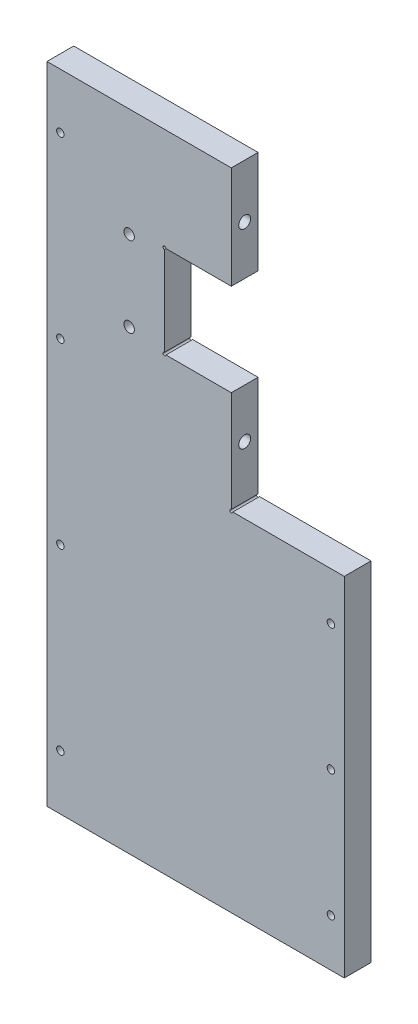
ISO-10303-21;
HEADER;
FILE_DESCRIPTION(('STEP AP214'),'2;1');
FILE_NAME('part.step','',(''),(''),'','','');
FILE_SCHEMA(('AUTOMOTIVE_DESIGN { 1 0 10303 214 1 1 1 1 }'));
ENDSEC;
DATA;
#1=APPLICATION_CONTEXT('core data for automotive mechanical design processes');
#2=APPLICATION_PROTOCOL_DEFINITION('international standard','automotive_design',2000,#1);
#3=PRODUCT_CONTEXT('',#1,'mechanical');
#4=PRODUCT('Part','Part','',(#3));
#5=PRODUCT_RELATED_PRODUCT_CATEGORY('part','',(#4));
#6=PRODUCT_DEFINITION_FORMATION('','',#4);
#7=PRODUCT_DEFINITION_CONTEXT('part definition',#1,'design');
#8=PRODUCT_DEFINITION('design','',#6,#7);
#9=PRODUCT_DEFINITION_SHAPE('','',#8);
#10=(LENGTH_UNIT() NAMED_UNIT(*) SI_UNIT(.MILLI.,.METRE.));
#11=(NAMED_UNIT(*) PLANE_ANGLE_UNIT() SI_UNIT($,.RADIAN.));
#12=(NAMED_UNIT(*) SI_UNIT($,.STERADIAN.) SOLID_ANGLE_UNIT());
#13=UNCERTAINTY_MEASURE_WITH_UNIT(LENGTH_MEASURE(1.E-05),#10,'distance_accuracy_value','');
#14=(GEOMETRIC_REPRESENTATION_CONTEXT(3) GLOBAL_UNCERTAINTY_ASSIGNED_CONTEXT((#13)) GLOBAL_UNIT_ASSIGNED_CONTEXT((#10,
#11,#12)) REPRESENTATION_CONTEXT('',''));
#15=CARTESIAN_POINT('',(0.,0.,0.));
#16=DIRECTION('',(0.,0.,1.));
#17=DIRECTION('',(1.,0.,0.));
#18=AXIS2_PLACEMENT_3D('',#15,#16,#17);
#19=CARTESIAN_POINT('',(0.,0.,18.));
#20=DIRECTION('',(1.,0.,0.));
#21=DIRECTION('',(0.,0.,-1.));
#22=AXIS2_PLACEMENT_3D('',#19,#20,#21);
#23=PLANE('',#22);
#24=DIRECTION('',(0.,-1.,0.));
#25=VECTOR('',#24,1.);
#26=CARTESIAN_POINT('',(0.,0.,0.));
#27=LINE('',#26,#25);
#28=CARTESIAN_POINT('',(0.,434.,0.));
#29=VERTEX_POINT('',#28);
#30=CARTESIAN_POINT('',(0.,0.,0.));
#31=VERTEX_POINT('',#30);
#32=EDGE_CURVE('E203',#29,#31,#27,.T.);
#33=ORIENTED_EDGE('',*,*,#32,.T.);
#34=DIRECTION('',(0.,0.,-1.));
#35=VECTOR('',#34,1.);
#36=CARTESIAN_POINT('',(0.,0.,18.));
#37=LINE('',#36,#35);
#38=CARTESIAN_POINT('',(0.,0.,18.));
#39=VERTEX_POINT('',#38);
#40=EDGE_CURVE('E179',#39,#31,#37,.T.);
#41=ORIENTED_EDGE('',*,*,#40,.F.);
#42=DIRECTION('',(0.,-1.,0.));
#43=VECTOR('',#42,1.);
#44=CARTESIAN_POINT('',(0.,0.,18.));
#45=LINE('',#44,#43);
#46=CARTESIAN_POINT('',(0.,434.,18.));
#47=VERTEX_POINT('',#46);
#48=EDGE_CURVE('E160',#47,#39,#45,.T.);
#49=ORIENTED_EDGE('',*,*,#48,.F.);
#50=DIRECTION('',(0.,0.,-1.));
#51=VECTOR('',#50,1.);
#52=CARTESIAN_POINT('',(0.,434.,18.));
#53=LINE('',#52,#51);
#54=EDGE_CURVE('E161',#47,#29,#53,.T.);
#55=ORIENTED_EDGE('',*,*,#54,.T.);
#56=EDGE_LOOP('',(#33,#41,#49,#55));
#57=FACE_BOUND('',#56,.T.);
#58=ADVANCED_FACE('F34',(#57),#23,.F.);
#59=CARTESIAN_POINT('',(0.,0.,18.));
#60=DIRECTION('',(0.,1.,0.));
#61=DIRECTION('',(0.,0.,1.));
#62=AXIS2_PLACEMENT_3D('',#59,#60,#61);
#63=PLANE('',#62);
#64=DIRECTION('',(1.,0.,0.));
#65=VECTOR('',#64,1.);
#66=CARTESIAN_POINT('',(0.,0.,0.));
#67=LINE('',#66,#65);
#68=CARTESIAN_POINT('',(200.,0.,0.));
#69=VERTEX_POINT('',#68);
#70=EDGE_CURVE('E206',#31,#69,#67,.T.);
#71=ORIENTED_EDGE('',*,*,#70,.T.);
#72=DIRECTION('',(0.,0.,-1.));
#73=VECTOR('',#72,1.);
#74=CARTESIAN_POINT('',(200.,0.,18.));
#75=LINE('',#74,#73);
#76=CARTESIAN_POINT('',(200.,0.,18.));
#77=VERTEX_POINT('',#76);
#78=EDGE_CURVE('E176',#77,#69,#75,.T.);
#79=ORIENTED_EDGE('',*,*,#78,.F.);
#80=DIRECTION('',(1.,0.,0.));
#81=VECTOR('',#80,1.);
#82=CARTESIAN_POINT('',(0.,0.,18.));
#83=LINE('',#82,#81);
#84=EDGE_CURVE('E219',#39,#77,#83,.T.);
#85=ORIENTED_EDGE('',*,*,#84,.F.);
#86=ORIENTED_EDGE('',*,*,#40,.T.);
#87=EDGE_LOOP('',(#71,#79,#85,#86));
#88=FACE_BOUND('',#87,.T.);
#89=ADVANCED_FACE('F348',(#88),#63,.F.);
#90=CARTESIAN_POINT('',(200.,0.,18.));
#91=DIRECTION('',(-1.,0.,0.));
#92=DIRECTION('',(0.,0.,1.));
#93=AXIS2_PLACEMENT_3D('',#90,#91,#92);
#94=PLANE('',#93);
#95=DIRECTION('',(0.,1.,0.));
#96=VECTOR('',#95,1.);
#97=CARTESIAN_POINT('',(200.,0.,0.));
#98=LINE('',#97,#96);
#99=CARTESIAN_POINT('',(200.,234.,0.));
#100=VERTEX_POINT('',#99);
#101=EDGE_CURVE('E149',#69,#100,#98,.T.);
#102=ORIENTED_EDGE('',*,*,#101,.T.);
#103=DIRECTION('',(0.,0.,-1.));
#104=VECTOR('',#103,1.);
#105=CARTESIAN_POINT('',(200.,234.,18.));
#106=LINE('',#105,#104);
#107=CARTESIAN_POINT('',(200.,234.,18.));
#108=VERTEX_POINT('',#107);
#109=EDGE_CURVE('E173',#108,#100,#106,.T.);
#110=ORIENTED_EDGE('',*,*,#109,.F.);
#111=DIRECTION('',(0.,1.,0.));
#112=VECTOR('',#111,1.);
#113=CARTESIAN_POINT('',(200.,0.,18.));
#114=LINE('',#113,#112);
#115=EDGE_CURVE('E218',#77,#108,#114,.T.);
#116=ORIENTED_EDGE('',*,*,#115,.F.);
#117=ORIENTED_EDGE('',*,*,#78,.T.);
#118=EDGE_LOOP('',(#102,#110,#116,#117));
#119=FACE_BOUND('',#118,.T.);
#120=ADVANCED_FACE('F211',(#119),#94,.F.);
#121=CARTESIAN_POINT('',(200.,234.,18.));
#122=DIRECTION('',(0.,-1.,0.));
#123=DIRECTION('',(0.,0.,-1.));
#124=AXIS2_PLACEMENT_3D('',#121,#122,#123);
#125=PLANE('',#124);
#126=DIRECTION('',(-1.,0.,0.));
#127=VECTOR('',#126,1.);
#128=CARTESIAN_POINT('',(200.,234.,0.));
#129=LINE('',#128,#127);
#130=CARTESIAN_POINT('',(125.,234.,0.));
#131=VERTEX_POINT('',#130);
#132=EDGE_CURVE('E145',#100,#131,#129,.T.);
#133=ORIENTED_EDGE('',*,*,#132,.T.);
#134=DIRECTION('',(0.,0.,1.));
#135=VECTOR('',#134,1.);
#136=CARTESIAN_POINT('',(125.,234.,0.));
#137=LINE('',#136,#135);
#138=CARTESIAN_POINT('',(125.,234.,18.));
#139=VERTEX_POINT('',#138);
#140=EDGE_CURVE('E48',#131,#139,#137,.T.);
#141=ORIENTED_EDGE('',*,*,#140,.T.);
#142=DIRECTION('',(-1.,0.,0.));
#143=VECTOR('',#142,1.);
#144=CARTESIAN_POINT('',(200.,234.,18.));
#145=LINE('',#144,#143);
#146=EDGE_CURVE('E195',#108,#139,#145,.T.);
#147=ORIENTED_EDGE('',*,*,#146,.F.);
#148=ORIENTED_EDGE('',*,*,#109,.T.);
#149=EDGE_LOOP('',(#133,#141,#147,#148));
#150=FACE_BOUND('',#149,.T.);
#151=ADVANCED_FACE('F216',(#150),#125,.F.);
#152=CARTESIAN_POINT('',(124.,303.,18.));
#153=DIRECTION('',(-1.,0.,0.));
#154=DIRECTION('',(0.,-1.,0.));
#155=AXIS2_PLACEMENT_3D('',#152,#153,#154);
#156=PLANE('',#155);
#157=CARTESIAN_POINT('',(124.,270.,9.00000000000006));
#158=DIRECTION('',(1.,0.,0.));
#159=DIRECTION('',(0.,0.,-1.));
#160=AXIS2_PLACEMENT_3D('',#157,#158,#159);
#161=CIRCLE('',#160,4.);
#162=CARTESIAN_POINT('',(124.,270.,5.00000000000006));
#163=VERTEX_POINT('',#162);
#164=EDGE_CURVE('E287',#163,#163,#161,.T.);
#165=ORIENTED_EDGE('',*,*,#164,.F.);
#166=EDGE_LOOP('',(#165));
#167=FACE_BOUND('',#166,.T.);
#168=DIRECTION('',(0.,1.,0.));
#169=VECTOR('',#168,1.);
#170=CARTESIAN_POINT('',(124.,303.,18.));
#171=LINE('',#170,#169);
#172=CARTESIAN_POINT('',(124.,235.,18.));
#173=VERTEX_POINT('',#172);
#174=CARTESIAN_POINT('',(124.,303.,18.));
#175=VERTEX_POINT('',#174);
#176=EDGE_CURVE('E138',#173,#175,#171,.T.);
#177=ORIENTED_EDGE('',*,*,#176,.F.);
#178=DIRECTION('',(0.,0.,1.));
#179=VECTOR('',#178,1.);
#180=CARTESIAN_POINT('',(124.,235.,0.));
#181=LINE('',#180,#179);
#182=CARTESIAN_POINT('',(124.,235.,0.));
#183=VERTEX_POINT('',#182);
#184=EDGE_CURVE('E126',#173,#183,#181,.F.);
#185=ORIENTED_EDGE('',*,*,#184,.T.);
#186=DIRECTION('',(0.,1.,0.));
#187=VECTOR('',#186,1.);
#188=CARTESIAN_POINT('',(124.,303.,0.));
#189=LINE('',#188,#187);
#190=CARTESIAN_POINT('',(124.,303.,0.));
#191=VERTEX_POINT('',#190);
#192=EDGE_CURVE('E136',#183,#191,#189,.T.);
#193=ORIENTED_EDGE('',*,*,#192,.T.);
#194=DIRECTION('',(0.,0.,-1.));
#195=VECTOR('',#194,1.);
#196=CARTESIAN_POINT('',(124.,303.,18.));
#197=LINE('',#196,#195);
#198=EDGE_CURVE('E171',#175,#191,#197,.T.);
#199=ORIENTED_EDGE('',*,*,#198,.F.);
#200=EDGE_LOOP('',(#177,#185,#193,#199));
#201=FACE_BOUND('',#200,.T.);
#202=ADVANCED_FACE('F134',(#167,#201),#156,.F.);
#203=CARTESIAN_POINT('',(79.,303.,18.));
#204=DIRECTION('',(0.,-1.,0.));
#205=DIRECTION('',(0.,0.,-1.));
#206=AXIS2_PLACEMENT_3D('',#203,#204,#205);
#207=PLANE('',#206);
#208=DIRECTION('',(-1.,0.,0.));
#209=VECTOR('',#208,1.);
#210=CARTESIAN_POINT('',(79.,303.,0.));
#211=LINE('',#210,#209);
#212=CARTESIAN_POINT('',(80.,303.,0.));
#213=VERTEX_POINT('',#212);
#214=EDGE_CURVE('E144',#191,#213,#211,.T.);
#215=ORIENTED_EDGE('',*,*,#214,.T.);
#216=DIRECTION('',(0.,0.,1.));
#217=VECTOR('',#216,1.);
#218=CARTESIAN_POINT('',(80.,303.,0.));
#219=LINE('',#218,#217);
#220=CARTESIAN_POINT('',(80.,303.,18.));
#221=VERTEX_POINT('',#220);
#222=EDGE_CURVE('E55',#213,#221,#219,.T.);
#223=ORIENTED_EDGE('',*,*,#222,.T.);
#224=DIRECTION('',(-1.,0.,0.));
#225=VECTOR('',#224,1.);
#226=CARTESIAN_POINT('',(79.,303.,18.));
#227=LINE('',#226,#225);
#228=EDGE_CURVE('E188',#175,#221,#227,.T.);
#229=ORIENTED_EDGE('',*,*,#228,.F.);
#230=ORIENTED_EDGE('',*,*,#198,.T.);
#231=EDGE_LOOP('',(#215,#223,#229,#230));
#232=FACE_BOUND('',#231,.T.);
#233=ADVANCED_FACE('F185',(#232),#207,.F.);
#234=CARTESIAN_POINT('',(79.,365.,18.));
#235=DIRECTION('',(-1.,0.,0.));
#236=DIRECTION('',(0.,-1.,0.));
#237=AXIS2_PLACEMENT_3D('',#234,#235,#236);
#238=PLANE('',#237);
#239=DIRECTION('',(0.,1.,0.));
#240=VECTOR('',#239,1.);
#241=CARTESIAN_POINT('',(79.,365.,18.));
#242=LINE('',#241,#240);
#243=CARTESIAN_POINT('',(79.,304.,18.));
#244=VERTEX_POINT('',#243);
#245=CARTESIAN_POINT('',(79.,364.,18.));
#246=VERTEX_POINT('',#245);
#247=EDGE_CURVE('E191',#244,#246,#242,.T.);
#248=ORIENTED_EDGE('',*,*,#247,.F.);
#249=DIRECTION('',(0.,0.,1.));
#250=VECTOR('',#249,1.);
#251=CARTESIAN_POINT('',(79.,304.,0.));
#252=LINE('',#251,#250);
#253=CARTESIAN_POINT('',(79.,304.,0.));
#254=VERTEX_POINT('',#253);
#255=EDGE_CURVE('E236',#244,#254,#252,.F.);
#256=ORIENTED_EDGE('',*,*,#255,.T.);
#257=DIRECTION('',(0.,1.,0.));
#258=VECTOR('',#257,1.);
#259=CARTESIAN_POINT('',(79.,365.,0.));
#260=LINE('',#259,#258);
#261=CARTESIAN_POINT('',(79.,364.,0.));
#262=VERTEX_POINT('',#261);
#263=EDGE_CURVE('E147',#254,#262,#260,.T.);
#264=ORIENTED_EDGE('',*,*,#263,.T.);
#265=DIRECTION('',(0.,0.,1.));
#266=VECTOR('',#265,1.);
#267=CARTESIAN_POINT('',(79.,364.,0.));
#268=LINE('',#267,#266);
#269=EDGE_CURVE('E207',#262,#246,#268,.T.);
#270=ORIENTED_EDGE('',*,*,#269,.T.);
#271=EDGE_LOOP('',(#248,#256,#264,#270));
#272=FACE_BOUND('',#271,.T.);
#273=ADVANCED_FACE('F377',(#272),#238,.F.);
#274=CARTESIAN_POINT('',(124.,365.,18.));
#275=DIRECTION('',(0.,1.,0.));
#276=DIRECTION('',(-1.,0.,0.));
#277=AXIS2_PLACEMENT_3D('',#274,#275,#276);
#278=PLANE('',#277);
#279=DIRECTION('',(1.,0.,0.));
#280=VECTOR('',#279,1.);
#281=CARTESIAN_POINT('',(124.,365.,18.));
#282=LINE('',#281,#280);
#283=CARTESIAN_POINT('',(80.,365.,18.));
#284=VERTEX_POINT('',#283);
#285=CARTESIAN_POINT('',(124.,365.,18.));
#286=VERTEX_POINT('',#285);
#287=EDGE_CURVE('E193',#284,#286,#282,.T.);
#288=ORIENTED_EDGE('',*,*,#287,.F.);
#289=DIRECTION('',(0.,0.,1.));
#290=VECTOR('',#289,1.);
#291=CARTESIAN_POINT('',(80.,365.,0.));
#292=LINE('',#291,#290);
#293=CARTESIAN_POINT('',(80.,365.,0.));
#294=VERTEX_POINT('',#293);
#295=EDGE_CURVE('E227',#284,#294,#292,.F.);
#296=ORIENTED_EDGE('',*,*,#295,.T.);
#297=DIRECTION('',(1.,0.,0.));
#298=VECTOR('',#297,1.);
#299=CARTESIAN_POINT('',(124.,365.,0.));
#300=LINE('',#299,#298);
#301=CARTESIAN_POINT('',(124.,365.,0.));
#302=VERTEX_POINT('',#301);
#303=EDGE_CURVE('E154',#294,#302,#300,.T.);
#304=ORIENTED_EDGE('',*,*,#303,.T.);
#305=DIRECTION('',(0.,0.,-1.));
#306=VECTOR('',#305,1.);
#307=CARTESIAN_POINT('',(124.,365.,18.));
#308=LINE('',#307,#306);
#309=EDGE_CURVE('E168',#286,#302,#308,.T.);
#310=ORIENTED_EDGE('',*,*,#309,.F.);
#311=EDGE_LOOP('',(#288,#296,#304,#310));
#312=FACE_BOUND('',#311,.T.);
#313=ADVANCED_FACE('F370',(#312),#278,.F.);
#314=CARTESIAN_POINT('',(124.,434.,18.));
#315=DIRECTION('',(-1.,0.,0.));
#316=DIRECTION('',(0.,0.,1.));
#317=AXIS2_PLACEMENT_3D('',#314,#315,#316);
#318=PLANE('',#317);
#319=CARTESIAN_POINT('',(124.,398.,9.00000000000001));
#320=DIRECTION('',(1.,0.,0.));
#321=DIRECTION('',(0.,0.,-1.));
#322=AXIS2_PLACEMENT_3D('',#319,#320,#321);
#323=CIRCLE('',#322,4.);
#324=CARTESIAN_POINT('',(124.,398.,5.));
#325=VERTEX_POINT('',#324);
#326=EDGE_CURVE('E293',#325,#325,#323,.T.);
#327=ORIENTED_EDGE('',*,*,#326,.F.);
#328=EDGE_LOOP('',(#327));
#329=FACE_BOUND('',#328,.T.);
#330=DIRECTION('',(0.,1.,0.));
#331=VECTOR('',#330,1.);
#332=CARTESIAN_POINT('',(124.,434.,0.));
#333=LINE('',#332,#331);
#334=CARTESIAN_POINT('',(124.,434.,0.));
#335=VERTEX_POINT('',#334);
#336=EDGE_CURVE('E156',#302,#335,#333,.T.);
#337=ORIENTED_EDGE('',*,*,#336,.T.);
#338=DIRECTION('',(0.,0.,-1.));
#339=VECTOR('',#338,1.);
#340=CARTESIAN_POINT('',(124.,434.,18.));
#341=LINE('',#340,#339);
#342=CARTESIAN_POINT('',(124.,434.,18.));
#343=VERTEX_POINT('',#342);
#344=EDGE_CURVE('E164',#343,#335,#341,.T.);
#345=ORIENTED_EDGE('',*,*,#344,.F.);
#346=DIRECTION('',(0.,1.,0.));
#347=VECTOR('',#346,1.);
#348=CARTESIAN_POINT('',(124.,434.,18.));
#349=LINE('',#348,#347);
#350=EDGE_CURVE('E200',#286,#343,#349,.T.);
#351=ORIENTED_EDGE('',*,*,#350,.F.);
#352=ORIENTED_EDGE('',*,*,#309,.T.);
#353=EDGE_LOOP('',(#337,#345,#351,#352));
#354=FACE_BOUND('',#353,.T.);
#355=ADVANCED_FACE('F365',(#329,#354),#318,.F.);
#356=CARTESIAN_POINT('',(124.,434.,18.));
#357=DIRECTION('',(0.,-1.,0.));
#358=DIRECTION('',(0.,0.,-1.));
#359=AXIS2_PLACEMENT_3D('',#356,#357,#358);
#360=PLANE('',#359);
#361=DIRECTION('',(-1.,0.,0.));
#362=VECTOR('',#361,1.);
#363=CARTESIAN_POINT('',(124.,434.,0.));
#364=LINE('',#363,#362);
#365=EDGE_CURVE('E158',#335,#29,#364,.T.);
#366=ORIENTED_EDGE('',*,*,#365,.T.);
#367=ORIENTED_EDGE('',*,*,#54,.F.);
#368=DIRECTION('',(-1.,0.,0.));
#369=VECTOR('',#368,1.);
#370=CARTESIAN_POINT('',(124.,434.,18.));
#371=LINE('',#370,#369);
#372=EDGE_CURVE('E165',#343,#47,#371,.T.);
#373=ORIENTED_EDGE('',*,*,#372,.F.);
#374=ORIENTED_EDGE('',*,*,#344,.T.);
#375=EDGE_LOOP('',(#366,#367,#373,#374));
#376=FACE_BOUND('',#375,.T.);
#377=ADVANCED_FACE('F314',(#376),#360,.F.);
#378=CARTESIAN_POINT('',(0.,0.,18.));
#379=DIRECTION('',(0.,0.,1.));
#380=DIRECTION('',(1.,0.,0.));
#381=AXIS2_PLACEMENT_3D('',#378,#379,#380);
#382=PLANE('',#381);
#383=CARTESIAN_POINT('',(55.2879095828018,361.,18.));
#384=DIRECTION('',(0.,0.,1.));
#385=DIRECTION('',(1.,0.,0.));
#386=AXIS2_PLACEMENT_3D('',#383,#384,#385);
#387=CIRCLE('',#386,3.5);
#388=CARTESIAN_POINT('',(58.7879095828018,361.,18.));
#389=VERTEX_POINT('',#388);
#390=EDGE_CURVE('E305',#389,#389,#387,.T.);
#391=ORIENTED_EDGE('',*,*,#390,.F.);
#392=EDGE_LOOP('',(#391));
#393=FACE_BOUND('',#392,.T.);
#394=CARTESIAN_POINT('',(55.2879095828018,307.,18.));
#395=DIRECTION('',(0.,0.,1.));
#396=DIRECTION('',(1.,0.,0.));
#397=AXIS2_PLACEMENT_3D('',#394,#395,#396);
#398=CIRCLE('',#397,3.5);
#399=CARTESIAN_POINT('',(58.7879095828018,307.,18.));
#400=VERTEX_POINT('',#399);
#401=EDGE_CURVE('E299',#400,#400,#398,.T.);
#402=ORIENTED_EDGE('',*,*,#401,.F.);
#403=EDGE_LOOP('',(#402));
#404=FACE_BOUND('',#403,.T.);
#405=CARTESIAN_POINT('',(191.,202.,18.));
#406=DIRECTION('',(0.,0.,-1.));
#407=DIRECTION('',(-1.,0.,0.));
#408=AXIS2_PLACEMENT_3D('',#405,#406,#407);
#409=CIRCLE('',#408,2.5);
#410=CARTESIAN_POINT('',(188.5,202.,18.));
#411=VERTEX_POINT('',#410);
#412=EDGE_CURVE('E278',#411,#411,#409,.T.);
#413=ORIENTED_EDGE('',*,*,#412,.T.);
#414=EDGE_LOOP('',(#413));
#415=FACE_BOUND('',#414,.T.);
#416=CARTESIAN_POINT('',(191.,117.,18.));
#417=DIRECTION('',(0.,0.,-1.));
#418=DIRECTION('',(-1.,0.,0.));
#419=AXIS2_PLACEMENT_3D('',#416,#417,#418);
#420=CIRCLE('',#419,2.5);
#421=CARTESIAN_POINT('',(188.5,117.,18.));
#422=VERTEX_POINT('',#421);
#423=EDGE_CURVE('E272',#422,#422,#420,.T.);
#424=ORIENTED_EDGE('',*,*,#423,.T.);
#425=EDGE_LOOP('',(#424));
#426=FACE_BOUND('',#425,.T.);
#427=CARTESIAN_POINT('',(191.,32.,18.));
#428=DIRECTION('',(0.,0.,-1.));
#429=DIRECTION('',(-1.,0.,0.));
#430=AXIS2_PLACEMENT_3D('',#427,#428,#429);
#431=CIRCLE('',#430,2.5);
#432=CARTESIAN_POINT('',(188.5,32.,18.));
#433=VERTEX_POINT('',#432);
#434=EDGE_CURVE('E266',#433,#433,#431,.T.);
#435=ORIENTED_EDGE('',*,*,#434,.T.);
#436=EDGE_LOOP('',(#435));
#437=FACE_BOUND('',#436,.T.);
#438=CARTESIAN_POINT('',(9.,397.,18.));
#439=DIRECTION('',(0.,0.,1.));
#440=DIRECTION('',(1.,0.,0.));
#441=AXIS2_PLACEMENT_3D('',#438,#439,#440);
#442=CIRCLE('',#441,2.49999999999999);
#443=CARTESIAN_POINT('',(11.5,397.,18.));
#444=VERTEX_POINT('',#443);
#445=EDGE_CURVE('E263',#444,#444,#442,.T.);
#446=ORIENTED_EDGE('',*,*,#445,.F.);
#447=EDGE_LOOP('',(#446));
#448=FACE_BOUND('',#447,.T.);
#449=CARTESIAN_POINT('',(9.,277.,18.));
#450=DIRECTION('',(0.,0.,1.));
#451=DIRECTION('',(1.,0.,0.));
#452=AXIS2_PLACEMENT_3D('',#449,#450,#451);
#453=CIRCLE('',#452,2.49999999999999);
#454=CARTESIAN_POINT('',(11.5,277.,18.));
#455=VERTEX_POINT('',#454);
#456=EDGE_CURVE('E257',#455,#455,#453,.T.);
#457=ORIENTED_EDGE('',*,*,#456,.F.);
#458=EDGE_LOOP('',(#457));
#459=FACE_BOUND('',#458,.T.);
#460=CARTESIAN_POINT('',(9.,157.,18.));
#461=DIRECTION('',(0.,0.,1.));
#462=DIRECTION('',(1.,0.,0.));
#463=AXIS2_PLACEMENT_3D('',#460,#461,#462);
#464=CIRCLE('',#463,2.49999999999999);
#465=CARTESIAN_POINT('',(11.5,157.,18.));
#466=VERTEX_POINT('',#465);
#467=EDGE_CURVE('E251',#466,#466,#464,.T.);
#468=ORIENTED_EDGE('',*,*,#467,.F.);
#469=EDGE_LOOP('',(#468));
#470=FACE_BOUND('',#469,.T.);
#471=CARTESIAN_POINT('',(9.,37.,18.));
#472=DIRECTION('',(0.,0.,1.));
#473=DIRECTION('',(1.,0.,0.));
#474=AXIS2_PLACEMENT_3D('',#471,#472,#473);
#475=CIRCLE('',#474,2.49999999999999);
#476=CARTESIAN_POINT('',(11.5,37.,18.));
#477=VERTEX_POINT('',#476);
#478=EDGE_CURVE('E245',#477,#477,#475,.T.);
#479=ORIENTED_EDGE('',*,*,#478,.F.);
#480=EDGE_LOOP('',(#479));
#481=FACE_BOUND('',#480,.T.);
#482=CARTESIAN_POINT('',(124.,234.,18.));
#483=DIRECTION('',(0.,0.,1.));
#484=DIRECTION('',(1.,0.,0.));
#485=AXIS2_PLACEMENT_3D('',#482,#483,#484);
#486=CIRCLE('',#485,0.999999999999985);
#487=EDGE_CURVE('E139',#173,#139,#486,.T.);
#488=ORIENTED_EDGE('',*,*,#487,.F.);
#489=ORIENTED_EDGE('',*,*,#176,.T.);
#490=ORIENTED_EDGE('',*,*,#228,.T.);
#491=CARTESIAN_POINT('',(79.,303.,18.));
#492=DIRECTION('',(0.,0.,1.));
#493=DIRECTION('',(1.,0.,0.));
#494=AXIS2_PLACEMENT_3D('',#491,#492,#493);
#495=CIRCLE('',#494,0.999999999999998);
#496=EDGE_CURVE('E238',#244,#221,#495,.T.);
#497=ORIENTED_EDGE('',*,*,#496,.F.);
#498=ORIENTED_EDGE('',*,*,#247,.T.);
#499=CARTESIAN_POINT('',(79.,365.,18.));
#500=DIRECTION('',(0.,0.,1.));
#501=DIRECTION('',(1.,0.,0.));
#502=AXIS2_PLACEMENT_3D('',#499,#500,#501);
#503=CIRCLE('',#502,0.999999999999998);
#504=EDGE_CURVE('E231',#284,#246,#503,.T.);
#505=ORIENTED_EDGE('',*,*,#504,.F.);
#506=ORIENTED_EDGE('',*,*,#287,.T.);
#507=ORIENTED_EDGE('',*,*,#350,.T.);
#508=ORIENTED_EDGE('',*,*,#372,.T.);
#509=ORIENTED_EDGE('',*,*,#48,.T.);
#510=ORIENTED_EDGE('',*,*,#84,.T.);
#511=ORIENTED_EDGE('',*,*,#115,.T.);
#512=ORIENTED_EDGE('',*,*,#146,.T.);
#513=EDGE_LOOP('',(#488,#489,#490,#497,#498,#505,#506,#507,#508,#509,#510,#511,#512));
#514=FACE_BOUND('',#513,.T.);
#515=ADVANCED_FACE('F311',(#393,#404,#415,#426,#437,#448,#459,#470,#481,#514),#382,.T.);
#516=CARTESIAN_POINT('',(0.,0.,0.));
#517=DIRECTION('',(0.,0.,1.));
#518=DIRECTION('',(1.,0.,0.));
#519=AXIS2_PLACEMENT_3D('',#516,#517,#518);
#520=PLANE('',#519);
#521=CARTESIAN_POINT('',(55.2879095828018,361.,0.));
#522=DIRECTION('',(0.,0.,1.));
#523=DIRECTION('',(1.,0.,0.));
#524=AXIS2_PLACEMENT_3D('',#521,#522,#523);
#525=CIRCLE('',#524,3.5);
#526=CARTESIAN_POINT('',(58.7879095828018,361.,0.));
#527=VERTEX_POINT('',#526);
#528=EDGE_CURVE('E302',#527,#527,#525,.T.);
#529=ORIENTED_EDGE('',*,*,#528,.T.);
#530=EDGE_LOOP('',(#529));
#531=FACE_BOUND('',#530,.T.);
#532=CARTESIAN_POINT('',(55.2879095828018,307.,0.));
#533=DIRECTION('',(0.,0.,1.));
#534=DIRECTION('',(1.,0.,0.));
#535=AXIS2_PLACEMENT_3D('',#532,#533,#534);
#536=CIRCLE('',#535,3.5);
#537=CARTESIAN_POINT('',(58.7879095828018,307.,0.));
#538=VERTEX_POINT('',#537);
#539=EDGE_CURVE('E296',#538,#538,#536,.T.);
#540=ORIENTED_EDGE('',*,*,#539,.T.);
#541=EDGE_LOOP('',(#540));
#542=FACE_BOUND('',#541,.T.);
#543=CARTESIAN_POINT('',(191.,202.,0.));
#544=DIRECTION('',(0.,0.,-1.));
#545=DIRECTION('',(-1.,0.,0.));
#546=AXIS2_PLACEMENT_3D('',#543,#544,#545);
#547=CIRCLE('',#546,2.5);
#548=CARTESIAN_POINT('',(188.5,202.,0.));
#549=VERTEX_POINT('',#548);
#550=EDGE_CURVE('E281',#549,#549,#547,.T.);
#551=ORIENTED_EDGE('',*,*,#550,.F.);
#552=EDGE_LOOP('',(#551));
#553=FACE_BOUND('',#552,.T.);
#554=CARTESIAN_POINT('',(191.,117.,0.));
#555=DIRECTION('',(0.,0.,-1.));
#556=DIRECTION('',(-1.,0.,0.));
#557=AXIS2_PLACEMENT_3D('',#554,#555,#556);
#558=CIRCLE('',#557,2.5);
#559=CARTESIAN_POINT('',(188.5,117.,0.));
#560=VERTEX_POINT('',#559);
#561=EDGE_CURVE('E275',#560,#560,#558,.T.);
#562=ORIENTED_EDGE('',*,*,#561,.F.);
#563=EDGE_LOOP('',(#562));
#564=FACE_BOUND('',#563,.T.);
#565=CARTESIAN_POINT('',(191.,32.,0.));
#566=DIRECTION('',(0.,0.,-1.));
#567=DIRECTION('',(-1.,0.,0.));
#568=AXIS2_PLACEMENT_3D('',#565,#566,#567);
#569=CIRCLE('',#568,2.5);
#570=CARTESIAN_POINT('',(188.5,32.,0.));
#571=VERTEX_POINT('',#570);
#572=EDGE_CURVE('E269',#571,#571,#569,.T.);
#573=ORIENTED_EDGE('',*,*,#572,.F.);
#574=EDGE_LOOP('',(#573));
#575=FACE_BOUND('',#574,.T.);
#576=CARTESIAN_POINT('',(9.,397.,0.));
#577=DIRECTION('',(0.,0.,1.));
#578=DIRECTION('',(1.,0.,0.));
#579=AXIS2_PLACEMENT_3D('',#576,#577,#578);
#580=CIRCLE('',#579,2.49999999999999);
#581=CARTESIAN_POINT('',(11.5,397.,0.));
#582=VERTEX_POINT('',#581);
#583=EDGE_CURVE('E260',#582,#582,#580,.T.);
#584=ORIENTED_EDGE('',*,*,#583,.T.);
#585=EDGE_LOOP('',(#584));
#586=FACE_BOUND('',#585,.T.);
#587=CARTESIAN_POINT('',(9.,277.,0.));
#588=DIRECTION('',(0.,0.,1.));
#589=DIRECTION('',(1.,0.,0.));
#590=AXIS2_PLACEMENT_3D('',#587,#588,#589);
#591=CIRCLE('',#590,2.49999999999999);
#592=CARTESIAN_POINT('',(11.5,277.,0.));
#593=VERTEX_POINT('',#592);
#594=EDGE_CURVE('E254',#593,#593,#591,.T.);
#595=ORIENTED_EDGE('',*,*,#594,.T.);
#596=EDGE_LOOP('',(#595));
#597=FACE_BOUND('',#596,.T.);
#598=CARTESIAN_POINT('',(9.,157.,0.));
#599=DIRECTION('',(0.,0.,1.));
#600=DIRECTION('',(1.,0.,0.));
#601=AXIS2_PLACEMENT_3D('',#598,#599,#600);
#602=CIRCLE('',#601,2.49999999999999);
#603=CARTESIAN_POINT('',(11.5,157.,0.));
#604=VERTEX_POINT('',#603);
#605=EDGE_CURVE('E248',#604,#604,#602,.T.);
#606=ORIENTED_EDGE('',*,*,#605,.T.);
#607=EDGE_LOOP('',(#606));
#608=FACE_BOUND('',#607,.T.);
#609=CARTESIAN_POINT('',(9.,37.,0.));
#610=DIRECTION('',(0.,0.,1.));
#611=DIRECTION('',(1.,0.,0.));
#612=AXIS2_PLACEMENT_3D('',#609,#610,#611);
#613=CIRCLE('',#612,2.49999999999999);
#614=CARTESIAN_POINT('',(11.5,37.,0.));
#615=VERTEX_POINT('',#614);
#616=EDGE_CURVE('E242',#615,#615,#613,.T.);
#617=ORIENTED_EDGE('',*,*,#616,.T.);
#618=EDGE_LOOP('',(#617));
#619=FACE_BOUND('',#618,.T.);
#620=ORIENTED_EDGE('',*,*,#192,.F.);
#621=CARTESIAN_POINT('',(124.,234.,0.));
#622=DIRECTION('',(0.,0.,1.));
#623=DIRECTION('',(1.,0.,0.));
#624=AXIS2_PLACEMENT_3D('',#621,#622,#623);
#625=CIRCLE('',#624,0.999999999999985);
#626=EDGE_CURVE('E11',#183,#131,#625,.T.);
#627=ORIENTED_EDGE('',*,*,#626,.T.);
#628=ORIENTED_EDGE('',*,*,#132,.F.);
#629=ORIENTED_EDGE('',*,*,#101,.F.);
#630=ORIENTED_EDGE('',*,*,#70,.F.);
#631=ORIENTED_EDGE('',*,*,#32,.F.);
#632=ORIENTED_EDGE('',*,*,#365,.F.);
#633=ORIENTED_EDGE('',*,*,#336,.F.);
#634=ORIENTED_EDGE('',*,*,#303,.F.);
#635=CARTESIAN_POINT('',(79.,365.,0.));
#636=DIRECTION('',(0.,0.,1.));
#637=DIRECTION('',(1.,0.,0.));
#638=AXIS2_PLACEMENT_3D('',#635,#636,#637);
#639=CIRCLE('',#638,0.999999999999998);
#640=EDGE_CURVE('E230',#294,#262,#639,.T.);
#641=ORIENTED_EDGE('',*,*,#640,.T.);
#642=ORIENTED_EDGE('',*,*,#263,.F.);
#643=CARTESIAN_POINT('',(79.,303.,0.));
#644=DIRECTION('',(0.,0.,1.));
#645=DIRECTION('',(1.,0.,0.));
#646=AXIS2_PLACEMENT_3D('',#643,#644,#645);
#647=CIRCLE('',#646,0.999999999999998);
#648=EDGE_CURVE('E41',#254,#213,#647,.T.);
#649=ORIENTED_EDGE('',*,*,#648,.T.);
#650=ORIENTED_EDGE('',*,*,#214,.F.);
#651=EDGE_LOOP('',(#620,#627,#628,#629,#630,#631,#632,#633,#634,#641,#642,#649,#650));
#652=FACE_BOUND('',#651,.T.);
#653=ADVANCED_FACE('F142',(#531,#542,#553,#564,#575,#586,#597,#608,#619,#652),#520,.F.);
#654=CARTESIAN_POINT('',(79.,365.,0.));
#655=DIRECTION('',(0.,0.,1.));
#656=DIRECTION('',(1.,0.,0.));
#657=AXIS2_PLACEMENT_3D('',#654,#655,#656);
#658=CYLINDRICAL_SURFACE('',#657,0.999999999999998);
#659=ORIENTED_EDGE('',*,*,#640,.F.);
#660=ORIENTED_EDGE('',*,*,#295,.F.);
#661=ORIENTED_EDGE('',*,*,#504,.T.);
#662=ORIENTED_EDGE('',*,*,#269,.F.);
#663=EDGE_LOOP('',(#659,#660,#661,#662));
#664=FACE_BOUND('',#663,.T.);
#665=ADVANCED_FACE('F373',(#664),#658,.F.);
#666=CARTESIAN_POINT('',(79.,303.,0.));
#667=DIRECTION('',(0.,0.,1.));
#668=DIRECTION('',(1.,0.,0.));
#669=AXIS2_PLACEMENT_3D('',#666,#667,#668);
#670=CYLINDRICAL_SURFACE('',#669,0.999999999999998);
#671=ORIENTED_EDGE('',*,*,#648,.F.);
#672=ORIENTED_EDGE('',*,*,#255,.F.);
#673=ORIENTED_EDGE('',*,*,#496,.T.);
#674=ORIENTED_EDGE('',*,*,#222,.F.);
#675=EDGE_LOOP('',(#671,#672,#673,#674));
#676=FACE_BOUND('',#675,.T.);
#677=ADVANCED_FACE('F344',(#676),#670,.F.);
#678=CARTESIAN_POINT('',(124.,234.,0.));
#679=DIRECTION('',(0.,0.,1.));
#680=DIRECTION('',(1.,0.,0.));
#681=AXIS2_PLACEMENT_3D('',#678,#679,#680);
#682=CYLINDRICAL_SURFACE('',#681,0.999999999999985);
#683=ORIENTED_EDGE('',*,*,#626,.F.);
#684=ORIENTED_EDGE('',*,*,#184,.F.);
#685=ORIENTED_EDGE('',*,*,#487,.T.);
#686=ORIENTED_EDGE('',*,*,#140,.F.);
#687=EDGE_LOOP('',(#683,#684,#685,#686));
#688=FACE_BOUND('',#687,.T.);
#689=ADVANCED_FACE('F125',(#688),#682,.F.);
#690=CARTESIAN_POINT('',(9.,37.,18.));
#691=DIRECTION('',(0.,0.,1.));
#692=DIRECTION('',(1.,0.,0.));
#693=AXIS2_PLACEMENT_3D('',#690,#691,#692);
#694=CYLINDRICAL_SURFACE('',#693,2.49999999999999);
#695=ORIENTED_EDGE('',*,*,#616,.F.);
#696=EDGE_LOOP('',(#695));
#697=FACE_BOUND('',#696,.T.);
#698=ORIENTED_EDGE('',*,*,#478,.T.);
#699=EDGE_LOOP('',(#698));
#700=FACE_BOUND('',#699,.T.);
#701=ADVANCED_FACE('F332',(#697,#700),#694,.F.);
#702=CARTESIAN_POINT('',(9.,157.,18.));
#703=DIRECTION('',(0.,0.,1.));
#704=DIRECTION('',(1.,0.,0.));
#705=AXIS2_PLACEMENT_3D('',#702,#703,#704);
#706=CYLINDRICAL_SURFACE('',#705,2.49999999999999);
#707=ORIENTED_EDGE('',*,*,#605,.F.);
#708=EDGE_LOOP('',(#707));
#709=FACE_BOUND('',#708,.T.);
#710=ORIENTED_EDGE('',*,*,#467,.T.);
#711=EDGE_LOOP('',(#710));
#712=FACE_BOUND('',#711,.T.);
#713=ADVANCED_FACE('F334',(#709,#712),#706,.F.);
#714=CARTESIAN_POINT('',(9.,277.,18.));
#715=DIRECTION('',(0.,0.,1.));
#716=DIRECTION('',(1.,0.,0.));
#717=AXIS2_PLACEMENT_3D('',#714,#715,#716);
#718=CYLINDRICAL_SURFACE('',#717,2.49999999999999);
#719=ORIENTED_EDGE('',*,*,#594,.F.);
#720=EDGE_LOOP('',(#719));
#721=FACE_BOUND('',#720,.T.);
#722=ORIENTED_EDGE('',*,*,#456,.T.);
#723=EDGE_LOOP('',(#722));
#724=FACE_BOUND('',#723,.T.);
#725=ADVANCED_FACE('F341',(#721,#724),#718,.F.);
#726=CARTESIAN_POINT('',(9.,397.,18.));
#727=DIRECTION('',(0.,0.,1.));
#728=DIRECTION('',(1.,0.,0.));
#729=AXIS2_PLACEMENT_3D('',#726,#727,#728);
#730=CYLINDRICAL_SURFACE('',#729,2.49999999999999);
#731=ORIENTED_EDGE('',*,*,#583,.F.);
#732=EDGE_LOOP('',(#731));
#733=FACE_BOUND('',#732,.T.);
#734=ORIENTED_EDGE('',*,*,#445,.T.);
#735=EDGE_LOOP('',(#734));
#736=FACE_BOUND('',#735,.T.);
#737=ADVANCED_FACE('F482',(#733,#736),#730,.F.);
#738=CARTESIAN_POINT('',(191.,32.,0.));
#739=DIRECTION('',(0.,0.,-1.));
#740=DIRECTION('',(-1.,0.,0.));
#741=AXIS2_PLACEMENT_3D('',#738,#739,#740);
#742=CYLINDRICAL_SURFACE('',#741,2.5);
#743=ORIENTED_EDGE('',*,*,#434,.F.);
#744=EDGE_LOOP('',(#743));
#745=FACE_BOUND('',#744,.T.);
#746=ORIENTED_EDGE('',*,*,#572,.T.);
#747=EDGE_LOOP('',(#746));
#748=FACE_BOUND('',#747,.T.);
#749=ADVANCED_FACE('F492',(#745,#748),#742,.F.);
#750=CARTESIAN_POINT('',(191.,117.,0.));
#751=DIRECTION('',(0.,0.,-1.));
#752=DIRECTION('',(-1.,0.,0.));
#753=AXIS2_PLACEMENT_3D('',#750,#751,#752);
#754=CYLINDRICAL_SURFACE('',#753,2.5);
#755=ORIENTED_EDGE('',*,*,#423,.F.);
#756=EDGE_LOOP('',(#755));
#757=FACE_BOUND('',#756,.T.);
#758=ORIENTED_EDGE('',*,*,#561,.T.);
#759=EDGE_LOOP('',(#758));
#760=FACE_BOUND('',#759,.T.);
#761=ADVANCED_FACE('F502',(#757,#760),#754,.F.);
#762=CARTESIAN_POINT('',(191.,202.,0.));
#763=DIRECTION('',(0.,0.,-1.));
#764=DIRECTION('',(-1.,0.,0.));
#765=AXIS2_PLACEMENT_3D('',#762,#763,#764);
#766=CYLINDRICAL_SURFACE('',#765,2.5);
#767=ORIENTED_EDGE('',*,*,#412,.F.);
#768=EDGE_LOOP('',(#767));
#769=FACE_BOUND('',#768,.T.);
#770=ORIENTED_EDGE('',*,*,#550,.T.);
#771=EDGE_LOOP('',(#770));
#772=FACE_BOUND('',#771,.T.);
#773=ADVANCED_FACE('F511',(#769,#772),#766,.F.);
#774=CARTESIAN_POINT('',(98.,270.,9.00000000000006));
#775=DIRECTION('',(-1.,0.,0.));
#776=DIRECTION('',(0.,0.,1.));
#777=AXIS2_PLACEMENT_3D('',#774,#775,#776);
#778=PLANE('',#777);
#779=CARTESIAN_POINT('',(98.,270.,9.00000000000006));
#780=DIRECTION('',(1.,0.,0.));
#781=DIRECTION('',(0.,0.,-1.));
#782=AXIS2_PLACEMENT_3D('',#779,#780,#781);
#783=CIRCLE('',#782,4.);
#784=CARTESIAN_POINT('',(98.,270.,5.00000000000006));
#785=VERTEX_POINT('',#784);
#786=EDGE_CURVE('E284',#785,#785,#783,.T.);
#787=ORIENTED_EDGE('',*,*,#786,.T.);
#788=EDGE_LOOP('',(#787));
#789=FACE_BOUND('',#788,.T.);
#790=ADVANCED_FACE('F520',(#789),#778,.F.);
#791=CARTESIAN_POINT('',(124.,270.,9.00000000000006));
#792=DIRECTION('',(1.,0.,0.));
#793=DIRECTION('',(0.,0.,-1.));
#794=AXIS2_PLACEMENT_3D('',#791,#792,#793);
#795=CYLINDRICAL_SURFACE('',#794,4.);
#796=ORIENTED_EDGE('',*,*,#786,.F.);
#797=EDGE_LOOP('',(#796));
#798=FACE_BOUND('',#797,.T.);
#799=ORIENTED_EDGE('',*,*,#164,.T.);
#800=EDGE_LOOP('',(#799));
#801=FACE_BOUND('',#800,.T.);
#802=ADVANCED_FACE('F530',(#798,#801),#795,.F.);
#803=CARTESIAN_POINT('',(98.,398.,9.00000000000001));
#804=DIRECTION('',(-1.,0.,0.));
#805=DIRECTION('',(0.,0.,1.));
#806=AXIS2_PLACEMENT_3D('',#803,#804,#805);
#807=PLANE('',#806);
#808=CARTESIAN_POINT('',(98.,398.,9.00000000000001));
#809=DIRECTION('',(1.,0.,0.));
#810=DIRECTION('',(0.,0.,-1.));
#811=AXIS2_PLACEMENT_3D('',#808,#809,#810);
#812=CIRCLE('',#811,4.);
#813=CARTESIAN_POINT('',(98.,398.,5.));
#814=VERTEX_POINT('',#813);
#815=EDGE_CURVE('E290',#814,#814,#812,.T.);
#816=ORIENTED_EDGE('',*,*,#815,.T.);
#817=EDGE_LOOP('',(#816));
#818=FACE_BOUND('',#817,.T.);
#819=ADVANCED_FACE('F537',(#818),#807,.F.);
#820=CARTESIAN_POINT('',(124.,398.,9.00000000000001));
#821=DIRECTION('',(1.,0.,0.));
#822=DIRECTION('',(0.,0.,-1.));
#823=AXIS2_PLACEMENT_3D('',#820,#821,#822);
#824=CYLINDRICAL_SURFACE('',#823,4.);
#825=ORIENTED_EDGE('',*,*,#815,.F.);
#826=EDGE_LOOP('',(#825));
#827=FACE_BOUND('',#826,.T.);
#828=ORIENTED_EDGE('',*,*,#326,.T.);
#829=EDGE_LOOP('',(#828));
#830=FACE_BOUND('',#829,.T.);
#831=ADVANCED_FACE('F545',(#827,#830),#824,.F.);
#832=CARTESIAN_POINT('',(55.2879095828018,307.,18.));
#833=DIRECTION('',(0.,0.,1.));
#834=DIRECTION('',(1.,0.,0.));
#835=AXIS2_PLACEMENT_3D('',#832,#833,#834);
#836=CYLINDRICAL_SURFACE('',#835,3.5);
#837=ORIENTED_EDGE('',*,*,#539,.F.);
#838=EDGE_LOOP('',(#837));
#839=FACE_BOUND('',#838,.T.);
#840=ORIENTED_EDGE('',*,*,#401,.T.);
#841=EDGE_LOOP('',(#840));
#842=FACE_BOUND('',#841,.T.);
#843=ADVANCED_FACE('F552',(#839,#842),#836,.F.);
#844=CARTESIAN_POINT('',(55.2879095828018,361.,18.));
#845=DIRECTION('',(0.,0.,1.));
#846=DIRECTION('',(1.,0.,0.));
#847=AXIS2_PLACEMENT_3D('',#844,#845,#846);
#848=CYLINDRICAL_SURFACE('',#847,3.5);
#849=ORIENTED_EDGE('',*,*,#528,.F.);
#850=EDGE_LOOP('',(#849));
#851=FACE_BOUND('',#850,.T.);
#852=ORIENTED_EDGE('',*,*,#390,.T.);
#853=EDGE_LOOP('',(#852));
#854=FACE_BOUND('',#853,.T.);
#855=ADVANCED_FACE('F309',(#851,#854),#848,.F.);
#856=CLOSED_SHELL('',(#58,#89,#120,#151,#202,#233,#273,#313,#355,#377,#515,#653,#665,#677,#689,
#701,#713,#725,#737,#749,#761,#773,#790,#802,#819,#831,#843,#855));
#857=MANIFOLD_SOLID_BREP('B2',#856);
#858=ADVANCED_BREP_SHAPE_REPRESENTATION('',(#18,#857),#14);
#859=SHAPE_DEFINITION_REPRESENTATION(#9,#858);
ENDSEC;
END-ISO-10303-21;
